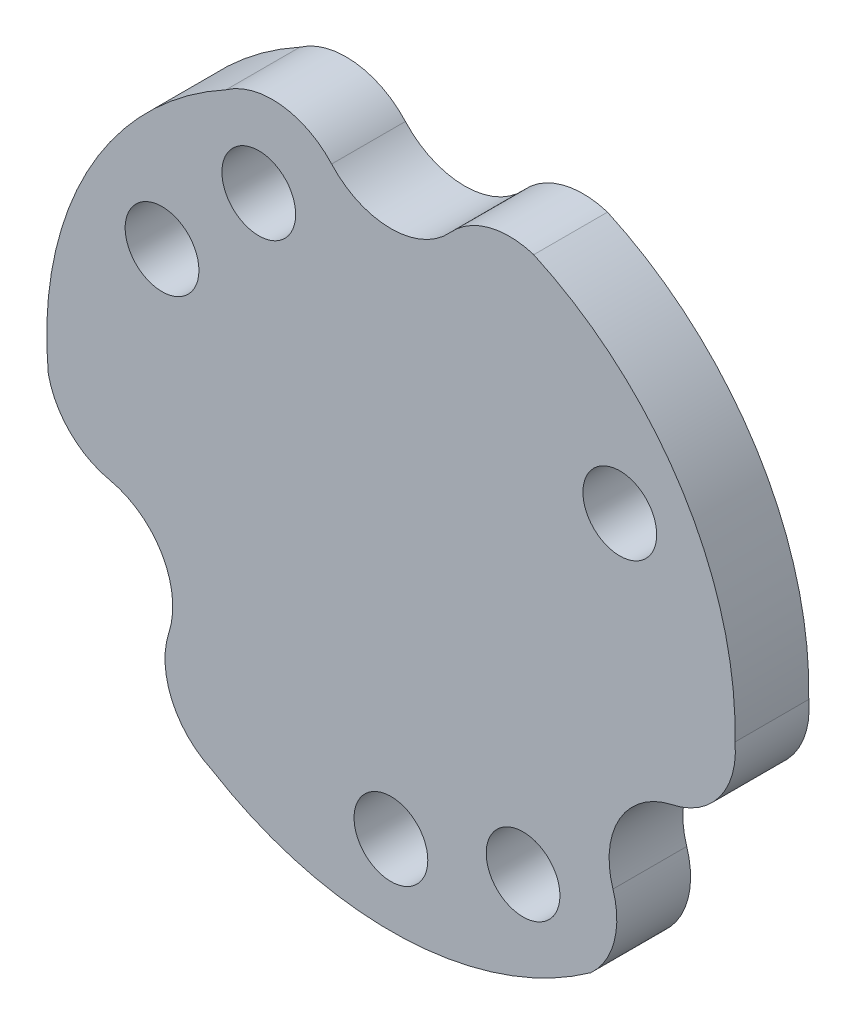
ISO-10303-21;
HEADER;
FILE_DESCRIPTION(('STEP AP214'),'2;1');
FILE_NAME('part.step','',(''),(''),'','','');
FILE_SCHEMA(('AUTOMOTIVE_DESIGN { 1 0 10303 214 1 1 1 1 }'));
ENDSEC;
DATA;
#1=APPLICATION_CONTEXT('core data for automotive mechanical design processes');
#2=APPLICATION_PROTOCOL_DEFINITION('international standard','automotive_design',2000,#1);
#3=PRODUCT_CONTEXT('',#1,'mechanical');
#4=PRODUCT('Part','Part','',(#3));
#5=PRODUCT_RELATED_PRODUCT_CATEGORY('part','',(#4));
#6=PRODUCT_DEFINITION_FORMATION('','',#4);
#7=PRODUCT_DEFINITION_CONTEXT('part definition',#1,'design');
#8=PRODUCT_DEFINITION('design','',#6,#7);
#9=PRODUCT_DEFINITION_SHAPE('','',#8);
#10=(LENGTH_UNIT() NAMED_UNIT(*) SI_UNIT(.MILLI.,.METRE.));
#11=(NAMED_UNIT(*) PLANE_ANGLE_UNIT() SI_UNIT($,.RADIAN.));
#12=(NAMED_UNIT(*) SI_UNIT($,.STERADIAN.) SOLID_ANGLE_UNIT());
#13=UNCERTAINTY_MEASURE_WITH_UNIT(LENGTH_MEASURE(1.E-05),#10,'distance_accuracy_value','');
#14=(GEOMETRIC_REPRESENTATION_CONTEXT(3) GLOBAL_UNCERTAINTY_ASSIGNED_CONTEXT((#13)) GLOBAL_UNIT_ASSIGNED_CONTEXT((#10,
#11,#12)) REPRESENTATION_CONTEXT('',''));
#15=CARTESIAN_POINT('',(0.,0.,0.));
#16=DIRECTION('',(0.,0.,1.));
#17=DIRECTION('',(1.,0.,0.));
#18=AXIS2_PLACEMENT_3D('',#15,#16,#17);
#19=CARTESIAN_POINT('',(5.38035373757222,-0.322325392410559,3.));
#20=DIRECTION('',(0.,0.,1.));
#21=DIRECTION('',(1.,0.,0.));
#22=AXIS2_PLACEMENT_3D('',#19,#20,#21);
#23=PLANE('',#22);
#24=CARTESIAN_POINT('',(5.37500000000057,-9.30977309068273,3.));
#25=DIRECTION('',(0.,0.,1.));
#26=DIRECTION('',(1.,0.,0.));
#27=AXIS2_PLACEMENT_3D('',#24,#25,#26);
#28=CIRCLE('',#27,1.49999999999978);
#29=CARTESIAN_POINT('',(6.87500000000036,-9.30977309068273,3.));
#30=VERTEX_POINT('',#29);
#31=EDGE_CURVE('E295',#30,#30,#28,.T.);
#32=ORIENTED_EDGE('',*,*,#31,.F.);
#33=EDGE_LOOP('',(#32));
#34=FACE_BOUND('',#33,.T.);
#35=CARTESIAN_POINT('',(0.,-10.75,3.));
#36=DIRECTION('',(0.,0.,1.));
#37=DIRECTION('',(1.,0.,0.));
#38=AXIS2_PLACEMENT_3D('',#35,#36,#37);
#39=CIRCLE('',#38,1.5);
#40=CARTESIAN_POINT('',(1.5,-10.75,3.));
#41=VERTEX_POINT('',#40);
#42=EDGE_CURVE('E307',#41,#41,#39,.T.);
#43=ORIENTED_EDGE('',*,*,#42,.F.);
#44=EDGE_LOOP('',(#43));
#45=FACE_BOUND('',#44,.T.);
#46=CARTESIAN_POINT('',(10.7607074751444,-0.644650784821117,3.));
#47=DIRECTION('',(0.,0.,1.));
#48=DIRECTION('',(1.,0.,0.));
#49=AXIS2_PLACEMENT_3D('',#46,#47,#48);
#50=CIRCLE('',#49,3.25);
#51=CARTESIAN_POINT('',(11.4425315640548,-3.82232539242045,3.));
#52=VERTEX_POINT('',#51);
#53=CARTESIAN_POINT('',(13.9959775932843,-0.335575935195618,3.));
#54=VERTEX_POINT('',#53);
#55=EDGE_CURVE('E177',#52,#54,#50,.T.);
#56=ORIENTED_EDGE('',*,*,#55,.T.);
#57=CARTESIAN_POINT('',(0.,0.,3.));
#58=DIRECTION('',(0.,0.,1.));
#59=DIRECTION('',(1.,0.,0.));
#60=AXIS2_PLACEMENT_3D('',#57,#58,#59);
#61=CIRCLE('',#60,14.);
#62=CARTESIAN_POINT('',(5.80943087987062,12.7377593340432,3.));
#63=VERTEX_POINT('',#62);
#64=EDGE_CURVE('E105',#54,#63,#61,.T.);
#65=ORIENTED_EDGE('',*,*,#64,.T.);
#66=CARTESIAN_POINT('',(4.82206978136234,9.64137142857136,3.));
#67=DIRECTION('',(0.,0.,1.));
#68=DIRECTION('',(1.,0.,0.));
#69=AXIS2_PLACEMENT_3D('',#66,#67,#68);
#70=CIRCLE('',#69,3.25);
#71=CARTESIAN_POINT('',(2.41103489067909,11.8206857142833,3.));
#72=VERTEX_POINT('',#71);
#73=EDGE_CURVE('E204',#63,#72,#70,.T.);
#74=ORIENTED_EDGE('',*,*,#73,.T.);
#75=CARTESIAN_POINT('',(1.07437023516552E-11,13.9999999999817,3.));
#76=DIRECTION('',(0.,0.,-1.));
#77=DIRECTION('',(1.,0.,0.));
#78=AXIS2_PLACEMENT_3D('',#75,#76,#77);
#79=CIRCLE('',#78,3.24999999997992);
#80=CARTESIAN_POINT('',(-2.41103489066096,11.820685714287,3.));
#81=VERTEX_POINT('',#80);
#82=EDGE_CURVE('E223',#72,#81,#79,.T.);
#83=ORIENTED_EDGE('',*,*,#82,.T.);
#84=CARTESIAN_POINT('',(-4.82206978134755,9.64137142857876,3.));
#85=DIRECTION('',(0.,0.,1.));
#86=DIRECTION('',(1.,0.,0.));
#87=AXIS2_PLACEMENT_3D('',#84,#85,#86);
#88=CIRCLE('',#87,3.25);
#89=CARTESIAN_POINT('',(-6.70737151186402,12.2886601141799,3.));
#90=VERTEX_POINT('',#89);
#91=EDGE_CURVE('E220',#81,#90,#88,.T.);
#92=ORIENTED_EDGE('',*,*,#91,.T.);
#93=CARTESIAN_POINT('',(0.,0.,3.));
#94=DIRECTION('',(0.,0.,1.));
#95=DIRECTION('',(1.,0.,0.));
#96=AXIS2_PLACEMENT_3D('',#93,#94,#95);
#97=CIRCLE('',#96,14.);
#98=CARTESIAN_POINT('',(-13.9359386105091,-1.33776494352389,3.));
#99=VERTEX_POINT('',#98);
#100=EDGE_CURVE('E222',#90,#99,#97,.T.);
#101=ORIENTED_EDGE('',*,*,#100,.T.);
#102=CARTESIAN_POINT('',(-10.7607074751454,-0.644650784804622,3.));
#103=DIRECTION('',(0.,0.,1.));
#104=DIRECTION('',(1.,0.,0.));
#105=AXIS2_PLACEMENT_3D('',#102,#103,#104);
#106=CIRCLE('',#105,3.25);
#107=CARTESIAN_POINT('',(-11.4425315640607,-3.82232539240291,3.));
#108=VERTEX_POINT('',#107);
#109=EDGE_CURVE('E225',#99,#108,#106,.T.);
#110=ORIENTED_EDGE('',*,*,#109,.T.);
#111=CARTESIAN_POINT('',(-12.1243556529717,-6.99999999998158,3.));
#112=DIRECTION('',(0.,0.,-1.));
#113=DIRECTION('',(1.,0.,0.));
#114=AXIS2_PLACEMENT_3D('',#111,#112,#113);
#115=CIRCLE('',#114,3.24999999997994);
#116=CARTESIAN_POINT('',(-9.03149667339383,-7.99836032186653,3.));
#117=VERTEX_POINT('',#116);
#118=EDGE_CURVE('E231',#108,#117,#115,.T.);
#119=ORIENTED_EDGE('',*,*,#118,.T.);
#120=CARTESIAN_POINT('',(-5.93863769379688,-8.99672064375764,3.));
#121=DIRECTION('',(0.,0.,1.));
#122=DIRECTION('',(1.,0.,0.));
#123=AXIS2_PLACEMENT_3D('',#120,#121,#122);
#124=CIRCLE('',#123,3.25);
#125=CARTESIAN_POINT('',(-7.28860608142029,-11.9530841789842,3.));
#126=VERTEX_POINT('',#125);
#127=EDGE_CURVE('E136',#117,#126,#124,.T.);
#128=ORIENTED_EDGE('',*,*,#127,.T.);
#129=CARTESIAN_POINT('',(0.,0.,3.));
#130=DIRECTION('',(0.,0.,1.));
#131=DIRECTION('',(1.,0.,0.));
#132=AXIS2_PLACEMENT_3D('',#129,#130,#131);
#133=CIRCLE('',#132,14.);
#134=CARTESIAN_POINT('',(8.12650773063849,-11.3999943905194,3.));
#135=VERTEX_POINT('',#134);
#136=EDGE_CURVE('E130',#126,#135,#133,.T.);
#137=ORIENTED_EDGE('',*,*,#136,.T.);
#138=CARTESIAN_POINT('',(5.93863769378309,-8.99672064376674,3.));
#139=DIRECTION('',(0.,0.,1.));
#140=DIRECTION('',(1.,0.,0.));
#141=AXIS2_PLACEMENT_3D('',#138,#139,#140);
#142=CIRCLE('',#141,3.25);
#143=CARTESIAN_POINT('',(9.03149667338157,-7.99836032188037,3.));
#144=VERTEX_POINT('',#143);
#145=EDGE_CURVE('E134',#135,#144,#142,.T.);
#146=ORIENTED_EDGE('',*,*,#145,.T.);
#147=CARTESIAN_POINT('',(12.124355652961,-7.00000000000017,3.));
#148=DIRECTION('',(0.,0.,-1.));
#149=DIRECTION('',(1.,0.,0.));
#150=AXIS2_PLACEMENT_3D('',#147,#148,#149);
#151=CIRCLE('',#150,3.24999999997994);
#152=EDGE_CURVE('E50',#144,#52,#151,.T.);
#153=ORIENTED_EDGE('',*,*,#152,.T.);
#154=EDGE_LOOP('',(#56,#65,#74,#83,#92,#101,#110,#119,#128,#137,#146,#153));
#155=FACE_BOUND('',#154,.T.);
#156=CARTESIAN_POINT('',(9.30977309068262,5.37500000000016,3.));
#157=DIRECTION('',(0.,0.,1.));
#158=DIRECTION('',(1.,0.,0.));
#159=AXIS2_PLACEMENT_3D('',#156,#157,#158);
#160=CIRCLE('',#159,1.5);
#161=CARTESIAN_POINT('',(10.8097730906826,5.37500000000016,3.));
#162=VERTEX_POINT('',#161);
#163=EDGE_CURVE('E158',#162,#162,#160,.T.);
#164=ORIENTED_EDGE('',*,*,#163,.F.);
#165=EDGE_LOOP('',(#164));
#166=FACE_BOUND('',#165,.T.);
#167=CARTESIAN_POINT('',(-9.30977309068277,5.37499999999991,3.));
#168=DIRECTION('',(0.,0.,1.));
#169=DIRECTION('',(1.,0.,0.));
#170=AXIS2_PLACEMENT_3D('',#167,#168,#169);
#171=CIRCLE('',#170,1.5);
#172=CARTESIAN_POINT('',(-7.80977309068277,5.37499999999991,3.));
#173=VERTEX_POINT('',#172);
#174=EDGE_CURVE('E301',#173,#173,#171,.T.);
#175=ORIENTED_EDGE('',*,*,#174,.F.);
#176=EDGE_LOOP('',(#175));
#177=FACE_BOUND('',#176,.T.);
#178=CARTESIAN_POINT('',(-5.37500000000028,9.30977309068221,3.));
#179=DIRECTION('',(0.,0.,1.));
#180=DIRECTION('',(1.,0.,0.));
#181=AXIS2_PLACEMENT_3D('',#178,#179,#180);
#182=CIRCLE('',#181,1.50000000000038);
#183=CARTESIAN_POINT('',(-3.8749999999999,9.30977309068221,3.));
#184=VERTEX_POINT('',#183);
#185=EDGE_CURVE('E286',#184,#184,#182,.T.);
#186=ORIENTED_EDGE('',*,*,#185,.F.);
#187=EDGE_LOOP('',(#186));
#188=FACE_BOUND('',#187,.T.);
#189=ADVANCED_FACE('F33',(#34,#45,#155,#166,#177,#188),#23,.T.);
#190=CARTESIAN_POINT('',(5.38035373757222,-0.322325392410559,0.));
#191=DIRECTION('',(0.,0.,1.));
#192=DIRECTION('',(1.,0.,0.));
#193=AXIS2_PLACEMENT_3D('',#190,#191,#192);
#194=PLANE('',#193);
#195=CARTESIAN_POINT('',(10.7607074751444,-0.644650784821117,0.));
#196=DIRECTION('',(0.,0.,1.));
#197=DIRECTION('',(1.,0.,0.));
#198=AXIS2_PLACEMENT_3D('',#195,#196,#197);
#199=CIRCLE('',#198,3.25);
#200=CARTESIAN_POINT('',(11.4425315640548,-3.82232539242045,0.));
#201=VERTEX_POINT('',#200);
#202=CARTESIAN_POINT('',(13.9959775932843,-0.335575935195618,0.));
#203=VERTEX_POINT('',#202);
#204=EDGE_CURVE('E154',#201,#203,#199,.T.);
#205=ORIENTED_EDGE('',*,*,#204,.F.);
#206=CARTESIAN_POINT('',(12.124355652961,-7.00000000000017,0.));
#207=DIRECTION('',(0.,0.,-1.));
#208=DIRECTION('',(1.,0.,0.));
#209=AXIS2_PLACEMENT_3D('',#206,#207,#208);
#210=CIRCLE('',#209,3.24999999997994);
#211=CARTESIAN_POINT('',(9.03149667338157,-7.99836032188037,0.));
#212=VERTEX_POINT('',#211);
#213=EDGE_CURVE('E97',#212,#201,#210,.T.);
#214=ORIENTED_EDGE('',*,*,#213,.F.);
#215=CARTESIAN_POINT('',(5.93863769378309,-8.99672064376674,0.));
#216=DIRECTION('',(0.,0.,1.));
#217=DIRECTION('',(1.,0.,0.));
#218=AXIS2_PLACEMENT_3D('',#215,#216,#217);
#219=CIRCLE('',#218,3.25);
#220=CARTESIAN_POINT('',(8.12650773063849,-11.3999943905194,0.));
#221=VERTEX_POINT('',#220);
#222=EDGE_CURVE('E91',#221,#212,#219,.T.);
#223=ORIENTED_EDGE('',*,*,#222,.F.);
#224=CARTESIAN_POINT('',(0.,0.,0.));
#225=DIRECTION('',(0.,0.,1.));
#226=DIRECTION('',(1.,0.,0.));
#227=AXIS2_PLACEMENT_3D('',#224,#225,#226);
#228=CIRCLE('',#227,14.);
#229=CARTESIAN_POINT('',(-7.28860608142029,-11.9530841789842,0.));
#230=VERTEX_POINT('',#229);
#231=EDGE_CURVE('E144',#230,#221,#228,.T.);
#232=ORIENTED_EDGE('',*,*,#231,.F.);
#233=CARTESIAN_POINT('',(-5.93863769379688,-8.99672064375764,0.));
#234=DIRECTION('',(0.,0.,1.));
#235=DIRECTION('',(1.,0.,0.));
#236=AXIS2_PLACEMENT_3D('',#233,#234,#235);
#237=CIRCLE('',#236,3.25);
#238=CARTESIAN_POINT('',(-9.03149667339383,-7.99836032186653,0.));
#239=VERTEX_POINT('',#238);
#240=EDGE_CURVE('E172',#239,#230,#237,.T.);
#241=ORIENTED_EDGE('',*,*,#240,.F.);
#242=CARTESIAN_POINT('',(-12.1243556529717,-6.99999999998158,0.));
#243=DIRECTION('',(0.,0.,-1.));
#244=DIRECTION('',(1.,0.,0.));
#245=AXIS2_PLACEMENT_3D('',#242,#243,#244);
#246=CIRCLE('',#245,3.24999999997994);
#247=CARTESIAN_POINT('',(-11.4425315640607,-3.82232539240291,0.));
#248=VERTEX_POINT('',#247);
#249=EDGE_CURVE('E170',#248,#239,#246,.T.);
#250=ORIENTED_EDGE('',*,*,#249,.F.);
#251=CARTESIAN_POINT('',(-10.7607074751454,-0.644650784804622,0.));
#252=DIRECTION('',(0.,0.,1.));
#253=DIRECTION('',(1.,0.,0.));
#254=AXIS2_PLACEMENT_3D('',#251,#252,#253);
#255=CIRCLE('',#254,3.25);
#256=CARTESIAN_POINT('',(-13.9359386105091,-1.33776494352389,0.));
#257=VERTEX_POINT('',#256);
#258=EDGE_CURVE('E168',#257,#248,#255,.T.);
#259=ORIENTED_EDGE('',*,*,#258,.F.);
#260=CARTESIAN_POINT('',(0.,0.,0.));
#261=DIRECTION('',(0.,0.,1.));
#262=DIRECTION('',(1.,0.,0.));
#263=AXIS2_PLACEMENT_3D('',#260,#261,#262);
#264=CIRCLE('',#263,14.);
#265=CARTESIAN_POINT('',(-6.70737151186402,12.2886601141799,0.));
#266=VERTEX_POINT('',#265);
#267=EDGE_CURVE('E166',#266,#257,#264,.T.);
#268=ORIENTED_EDGE('',*,*,#267,.F.);
#269=CARTESIAN_POINT('',(-4.82206978134755,9.64137142857876,0.));
#270=DIRECTION('',(0.,0.,1.));
#271=DIRECTION('',(1.,0.,0.));
#272=AXIS2_PLACEMENT_3D('',#269,#270,#271);
#273=CIRCLE('',#272,3.25);
#274=CARTESIAN_POINT('',(-2.41103489066096,11.820685714287,0.));
#275=VERTEX_POINT('',#274);
#276=EDGE_CURVE('E164',#275,#266,#273,.T.);
#277=ORIENTED_EDGE('',*,*,#276,.F.);
#278=CARTESIAN_POINT('',(1.07437023516552E-11,13.9999999999817,0.));
#279=DIRECTION('',(0.,0.,-1.));
#280=DIRECTION('',(1.,0.,0.));
#281=AXIS2_PLACEMENT_3D('',#278,#279,#280);
#282=CIRCLE('',#281,3.24999999997992);
#283=CARTESIAN_POINT('',(2.41103489067909,11.8206857142833,0.));
#284=VERTEX_POINT('',#283);
#285=EDGE_CURVE('E162',#284,#275,#282,.T.);
#286=ORIENTED_EDGE('',*,*,#285,.F.);
#287=CARTESIAN_POINT('',(4.82206978136234,9.64137142857136,0.));
#288=DIRECTION('',(0.,0.,1.));
#289=DIRECTION('',(1.,0.,0.));
#290=AXIS2_PLACEMENT_3D('',#287,#288,#289);
#291=CIRCLE('',#290,3.25);
#292=CARTESIAN_POINT('',(5.80943087987062,12.7377593340432,0.));
#293=VERTEX_POINT('',#292);
#294=EDGE_CURVE('E160',#293,#284,#291,.T.);
#295=ORIENTED_EDGE('',*,*,#294,.F.);
#296=CARTESIAN_POINT('',(0.,0.,0.));
#297=DIRECTION('',(0.,0.,1.));
#298=DIRECTION('',(1.,0.,0.));
#299=AXIS2_PLACEMENT_3D('',#296,#297,#298);
#300=CIRCLE('',#299,14.);
#301=EDGE_CURVE('E157',#203,#293,#300,.T.);
#302=ORIENTED_EDGE('',*,*,#301,.F.);
#303=EDGE_LOOP('',(#205,#214,#223,#232,#241,#250,#259,#268,#277,#286,#295,#302));
#304=FACE_BOUND('',#303,.T.);
#305=CARTESIAN_POINT('',(9.30977309068262,5.37500000000016,0.));
#306=DIRECTION('',(0.,0.,1.));
#307=DIRECTION('',(1.,0.,0.));
#308=AXIS2_PLACEMENT_3D('',#305,#306,#307);
#309=CIRCLE('',#308,1.5);
#310=CARTESIAN_POINT('',(10.8097730906826,5.37500000000016,0.));
#311=VERTEX_POINT('',#310);
#312=EDGE_CURVE('E310',#311,#311,#309,.T.);
#313=ORIENTED_EDGE('',*,*,#312,.T.);
#314=EDGE_LOOP('',(#313));
#315=FACE_BOUND('',#314,.T.);
#316=CARTESIAN_POINT('',(0.,-10.75,0.));
#317=DIRECTION('',(0.,0.,1.));
#318=DIRECTION('',(1.,0.,0.));
#319=AXIS2_PLACEMENT_3D('',#316,#317,#318);
#320=CIRCLE('',#319,1.5);
#321=CARTESIAN_POINT('',(1.5,-10.75,0.));
#322=VERTEX_POINT('',#321);
#323=EDGE_CURVE('E304',#322,#322,#320,.T.);
#324=ORIENTED_EDGE('',*,*,#323,.T.);
#325=EDGE_LOOP('',(#324));
#326=FACE_BOUND('',#325,.T.);
#327=CARTESIAN_POINT('',(-9.30977309068277,5.37499999999991,0.));
#328=DIRECTION('',(0.,0.,1.));
#329=DIRECTION('',(1.,0.,0.));
#330=AXIS2_PLACEMENT_3D('',#327,#328,#329);
#331=CIRCLE('',#330,1.5);
#332=CARTESIAN_POINT('',(-7.80977309068277,5.37499999999991,0.));
#333=VERTEX_POINT('',#332);
#334=EDGE_CURVE('E298',#333,#333,#331,.T.);
#335=ORIENTED_EDGE('',*,*,#334,.T.);
#336=EDGE_LOOP('',(#335));
#337=FACE_BOUND('',#336,.T.);
#338=CARTESIAN_POINT('',(5.37500000000057,-9.30977309068273,0.));
#339=DIRECTION('',(0.,0.,1.));
#340=DIRECTION('',(1.,0.,0.));
#341=AXIS2_PLACEMENT_3D('',#338,#339,#340);
#342=CIRCLE('',#341,1.49999999999978);
#343=CARTESIAN_POINT('',(6.87500000000036,-9.30977309068273,0.));
#344=VERTEX_POINT('',#343);
#345=EDGE_CURVE('E292',#344,#344,#342,.T.);
#346=ORIENTED_EDGE('',*,*,#345,.T.);
#347=EDGE_LOOP('',(#346));
#348=FACE_BOUND('',#347,.T.);
#349=CARTESIAN_POINT('',(-5.37500000000028,9.30977309068221,0.));
#350=DIRECTION('',(0.,0.,1.));
#351=DIRECTION('',(1.,0.,0.));
#352=AXIS2_PLACEMENT_3D('',#349,#350,#351);
#353=CIRCLE('',#352,1.50000000000038);
#354=CARTESIAN_POINT('',(-3.8749999999999,9.30977309068221,0.));
#355=VERTEX_POINT('',#354);
#356=EDGE_CURVE('E289',#355,#355,#353,.T.);
#357=ORIENTED_EDGE('',*,*,#356,.T.);
#358=EDGE_LOOP('',(#357));
#359=FACE_BOUND('',#358,.T.);
#360=ADVANCED_FACE('F208',(#304,#315,#326,#337,#348,#359),#194,.F.);
#361=CARTESIAN_POINT('',(10.7607074751444,-0.644650784821117,3.));
#362=DIRECTION('',(0.,0.,-1.));
#363=DIRECTION('',(-1.,0.,0.));
#364=AXIS2_PLACEMENT_3D('',#361,#362,#363);
#365=CYLINDRICAL_SURFACE('',#364,3.25);
#366=ORIENTED_EDGE('',*,*,#204,.T.);
#367=DIRECTION('',(0.,0.,-1.));
#368=VECTOR('',#367,1.);
#369=CARTESIAN_POINT('',(13.9959775932843,-0.335575935195618,3.));
#370=LINE('',#369,#368);
#371=EDGE_CURVE('E11',#54,#203,#370,.T.);
#372=ORIENTED_EDGE('',*,*,#371,.F.);
#373=ORIENTED_EDGE('',*,*,#55,.F.);
#374=DIRECTION('',(0.,0.,-1.));
#375=VECTOR('',#374,1.);
#376=CARTESIAN_POINT('',(11.4425315640548,-3.82232539242045,3.));
#377=LINE('',#376,#375);
#378=EDGE_CURVE('E150',#52,#201,#377,.T.);
#379=ORIENTED_EDGE('',*,*,#378,.T.);
#380=EDGE_LOOP('',(#366,#372,#373,#379));
#381=FACE_BOUND('',#380,.T.);
#382=ADVANCED_FACE('F35',(#381),#365,.T.);
#383=CARTESIAN_POINT('',(0.,0.,3.));
#384=DIRECTION('',(0.,0.,-1.));
#385=DIRECTION('',(-1.,0.,0.));
#386=AXIS2_PLACEMENT_3D('',#383,#384,#385);
#387=CYLINDRICAL_SURFACE('',#386,14.);
#388=ORIENTED_EDGE('',*,*,#301,.T.);
#389=DIRECTION('',(0.,0.,-1.));
#390=VECTOR('',#389,1.);
#391=CARTESIAN_POINT('',(5.80943087987062,12.7377593340432,3.));
#392=LINE('',#391,#390);
#393=EDGE_CURVE('E42',#63,#293,#392,.T.);
#394=ORIENTED_EDGE('',*,*,#393,.F.);
#395=ORIENTED_EDGE('',*,*,#64,.F.);
#396=ORIENTED_EDGE('',*,*,#371,.T.);
#397=EDGE_LOOP('',(#388,#394,#395,#396));
#398=FACE_BOUND('',#397,.T.);
#399=ADVANCED_FACE('F429',(#398),#387,.T.);
#400=CARTESIAN_POINT('',(4.82206978136234,9.64137142857136,3.));
#401=DIRECTION('',(0.,0.,-1.));
#402=DIRECTION('',(-1.,0.,0.));
#403=AXIS2_PLACEMENT_3D('',#400,#401,#402);
#404=CYLINDRICAL_SURFACE('',#403,3.25);
#405=ORIENTED_EDGE('',*,*,#294,.T.);
#406=DIRECTION('',(0.,0.,-1.));
#407=VECTOR('',#406,1.);
#408=CARTESIAN_POINT('',(2.41103489067909,11.8206857142833,3.));
#409=LINE('',#408,#407);
#410=EDGE_CURVE('E196',#72,#284,#409,.T.);
#411=ORIENTED_EDGE('',*,*,#410,.F.);
#412=ORIENTED_EDGE('',*,*,#73,.F.);
#413=ORIENTED_EDGE('',*,*,#393,.T.);
#414=EDGE_LOOP('',(#405,#411,#412,#413));
#415=FACE_BOUND('',#414,.T.);
#416=ADVANCED_FACE('F202',(#415),#404,.T.);
#417=CARTESIAN_POINT('',(1.07437023516552E-11,13.9999999999817,3.));
#418=DIRECTION('',(0.,0.,-1.));
#419=DIRECTION('',(-1.,0.,0.));
#420=AXIS2_PLACEMENT_3D('',#417,#418,#419);
#421=CYLINDRICAL_SURFACE('',#420,3.24999999997992);
#422=ORIENTED_EDGE('',*,*,#285,.T.);
#423=DIRECTION('',(0.,0.,-1.));
#424=VECTOR('',#423,1.);
#425=CARTESIAN_POINT('',(-2.41103489066096,11.820685714287,3.));
#426=LINE('',#425,#424);
#427=EDGE_CURVE('E193',#81,#275,#426,.T.);
#428=ORIENTED_EDGE('',*,*,#427,.F.);
#429=ORIENTED_EDGE('',*,*,#82,.F.);
#430=ORIENTED_EDGE('',*,*,#410,.T.);
#431=EDGE_LOOP('',(#422,#428,#429,#430));
#432=FACE_BOUND('',#431,.T.);
#433=ADVANCED_FACE('F214',(#432),#421,.F.);
#434=CARTESIAN_POINT('',(-4.82206978134755,9.64137142857876,3.));
#435=DIRECTION('',(0.,0.,-1.));
#436=DIRECTION('',(-1.,0.,0.));
#437=AXIS2_PLACEMENT_3D('',#434,#435,#436);
#438=CYLINDRICAL_SURFACE('',#437,3.25);
#439=ORIENTED_EDGE('',*,*,#276,.T.);
#440=DIRECTION('',(0.,0.,-1.));
#441=VECTOR('',#440,1.);
#442=CARTESIAN_POINT('',(-6.70737151186402,12.2886601141799,3.));
#443=LINE('',#442,#441);
#444=EDGE_CURVE('E190',#90,#266,#443,.T.);
#445=ORIENTED_EDGE('',*,*,#444,.F.);
#446=ORIENTED_EDGE('',*,*,#91,.F.);
#447=ORIENTED_EDGE('',*,*,#427,.T.);
#448=EDGE_LOOP('',(#439,#445,#446,#447));
#449=FACE_BOUND('',#448,.T.);
#450=ADVANCED_FACE('F218',(#449),#438,.T.);
#451=CARTESIAN_POINT('',(0.,0.,3.));
#452=DIRECTION('',(0.,0.,-1.));
#453=DIRECTION('',(-1.,0.,0.));
#454=AXIS2_PLACEMENT_3D('',#451,#452,#453);
#455=CYLINDRICAL_SURFACE('',#454,14.);
#456=ORIENTED_EDGE('',*,*,#267,.T.);
#457=DIRECTION('',(0.,0.,-1.));
#458=VECTOR('',#457,1.);
#459=CARTESIAN_POINT('',(-13.9359386105091,-1.33776494352389,3.));
#460=LINE('',#459,#458);
#461=EDGE_CURVE('E187',#99,#257,#460,.T.);
#462=ORIENTED_EDGE('',*,*,#461,.F.);
#463=ORIENTED_EDGE('',*,*,#100,.F.);
#464=ORIENTED_EDGE('',*,*,#444,.T.);
#465=EDGE_LOOP('',(#456,#462,#463,#464));
#466=FACE_BOUND('',#465,.T.);
#467=ADVANCED_FACE('F394',(#466),#455,.T.);
#468=CARTESIAN_POINT('',(-10.7607074751454,-0.644650784804622,3.));
#469=DIRECTION('',(0.,0.,-1.));
#470=DIRECTION('',(-1.,0.,0.));
#471=AXIS2_PLACEMENT_3D('',#468,#469,#470);
#472=CYLINDRICAL_SURFACE('',#471,3.25);
#473=ORIENTED_EDGE('',*,*,#258,.T.);
#474=DIRECTION('',(0.,0.,-1.));
#475=VECTOR('',#474,1.);
#476=CARTESIAN_POINT('',(-11.4425315640607,-3.82232539240291,3.));
#477=LINE('',#476,#475);
#478=EDGE_CURVE('E184',#108,#248,#477,.T.);
#479=ORIENTED_EDGE('',*,*,#478,.F.);
#480=ORIENTED_EDGE('',*,*,#109,.F.);
#481=ORIENTED_EDGE('',*,*,#461,.T.);
#482=EDGE_LOOP('',(#473,#479,#480,#481));
#483=FACE_BOUND('',#482,.T.);
#484=ADVANCED_FACE('F385',(#483),#472,.T.);
#485=CARTESIAN_POINT('',(-12.1243556529717,-6.99999999998158,3.));
#486=DIRECTION('',(0.,0.,-1.));
#487=DIRECTION('',(-1.,0.,0.));
#488=AXIS2_PLACEMENT_3D('',#485,#486,#487);
#489=CYLINDRICAL_SURFACE('',#488,3.24999999997994);
#490=ORIENTED_EDGE('',*,*,#249,.T.);
#491=DIRECTION('',(0.,0.,-1.));
#492=VECTOR('',#491,1.);
#493=CARTESIAN_POINT('',(-9.03149667339383,-7.99836032186653,3.));
#494=LINE('',#493,#492);
#495=EDGE_CURVE('E181',#117,#239,#494,.T.);
#496=ORIENTED_EDGE('',*,*,#495,.F.);
#497=ORIENTED_EDGE('',*,*,#118,.F.);
#498=ORIENTED_EDGE('',*,*,#478,.T.);
#499=EDGE_LOOP('',(#490,#496,#497,#498));
#500=FACE_BOUND('',#499,.T.);
#501=ADVANCED_FACE('F237',(#500),#489,.F.);
#502=CARTESIAN_POINT('',(-5.93863769379688,-8.99672064375764,3.));
#503=DIRECTION('',(0.,0.,-1.));
#504=DIRECTION('',(-1.,0.,0.));
#505=AXIS2_PLACEMENT_3D('',#502,#503,#504);
#506=CYLINDRICAL_SURFACE('',#505,3.25);
#507=ORIENTED_EDGE('',*,*,#240,.T.);
#508=DIRECTION('',(0.,0.,-1.));
#509=VECTOR('',#508,1.);
#510=CARTESIAN_POINT('',(-7.28860608142029,-11.9530841789842,3.));
#511=LINE('',#510,#509);
#512=EDGE_CURVE('E145',#126,#230,#511,.T.);
#513=ORIENTED_EDGE('',*,*,#512,.F.);
#514=ORIENTED_EDGE('',*,*,#127,.F.);
#515=ORIENTED_EDGE('',*,*,#495,.T.);
#516=EDGE_LOOP('',(#507,#513,#514,#515));
#517=FACE_BOUND('',#516,.T.);
#518=ADVANCED_FACE('F241',(#517),#506,.T.);
#519=CARTESIAN_POINT('',(0.,0.,3.));
#520=DIRECTION('',(0.,0.,-1.));
#521=DIRECTION('',(-1.,0.,0.));
#522=AXIS2_PLACEMENT_3D('',#519,#520,#521);
#523=CYLINDRICAL_SURFACE('',#522,14.);
#524=ORIENTED_EDGE('',*,*,#231,.T.);
#525=DIRECTION('',(0.,0.,-1.));
#526=VECTOR('',#525,1.);
#527=CARTESIAN_POINT('',(8.12650773063849,-11.3999943905194,3.));
#528=LINE('',#527,#526);
#529=EDGE_CURVE('E141',#135,#221,#528,.T.);
#530=ORIENTED_EDGE('',*,*,#529,.F.);
#531=ORIENTED_EDGE('',*,*,#136,.F.);
#532=ORIENTED_EDGE('',*,*,#512,.T.);
#533=EDGE_LOOP('',(#524,#530,#531,#532));
#534=FACE_BOUND('',#533,.T.);
#535=ADVANCED_FACE('F142',(#534),#523,.T.);
#536=CARTESIAN_POINT('',(5.93863769378309,-8.99672064376674,3.));
#537=DIRECTION('',(0.,0.,-1.));
#538=DIRECTION('',(-1.,0.,0.));
#539=AXIS2_PLACEMENT_3D('',#536,#537,#538);
#540=CYLINDRICAL_SURFACE('',#539,3.25);
#541=ORIENTED_EDGE('',*,*,#222,.T.);
#542=DIRECTION('',(0.,0.,-1.));
#543=VECTOR('',#542,1.);
#544=CARTESIAN_POINT('',(9.03149667338157,-7.99836032188037,3.));
#545=LINE('',#544,#543);
#546=EDGE_CURVE('E146',#144,#212,#545,.T.);
#547=ORIENTED_EDGE('',*,*,#546,.F.);
#548=ORIENTED_EDGE('',*,*,#145,.F.);
#549=ORIENTED_EDGE('',*,*,#529,.T.);
#550=EDGE_LOOP('',(#541,#547,#548,#549));
#551=FACE_BOUND('',#550,.T.);
#552=ADVANCED_FACE('F148',(#551),#540,.T.);
#553=CARTESIAN_POINT('',(12.124355652961,-7.00000000000017,3.));
#554=DIRECTION('',(0.,0.,-1.));
#555=DIRECTION('',(-1.,0.,0.));
#556=AXIS2_PLACEMENT_3D('',#553,#554,#555);
#557=CYLINDRICAL_SURFACE('',#556,3.24999999997994);
#558=ORIENTED_EDGE('',*,*,#213,.T.);
#559=ORIENTED_EDGE('',*,*,#378,.F.);
#560=ORIENTED_EDGE('',*,*,#152,.F.);
#561=ORIENTED_EDGE('',*,*,#546,.T.);
#562=EDGE_LOOP('',(#558,#559,#560,#561));
#563=FACE_BOUND('',#562,.T.);
#564=ADVANCED_FACE('F245',(#563),#557,.F.);
#565=CARTESIAN_POINT('',(9.30977309068262,5.37500000000016,3.));
#566=DIRECTION('',(0.,0.,-1.));
#567=DIRECTION('',(-1.,0.,0.));
#568=AXIS2_PLACEMENT_3D('',#565,#566,#567);
#569=CYLINDRICAL_SURFACE('',#568,1.5);
#570=ORIENTED_EDGE('',*,*,#163,.T.);
#571=EDGE_LOOP('',(#570));
#572=FACE_BOUND('',#571,.T.);
#573=ORIENTED_EDGE('',*,*,#312,.F.);
#574=EDGE_LOOP('',(#573));
#575=FACE_BOUND('',#574,.T.);
#576=ADVANCED_FACE('F247',(#572,#575),#569,.F.);
#577=CARTESIAN_POINT('',(0.,-10.75,3.));
#578=DIRECTION('',(0.,0.,-1.));
#579=DIRECTION('',(-1.,0.,0.));
#580=AXIS2_PLACEMENT_3D('',#577,#578,#579);
#581=CYLINDRICAL_SURFACE('',#580,1.5);
#582=ORIENTED_EDGE('',*,*,#42,.T.);
#583=EDGE_LOOP('',(#582));
#584=FACE_BOUND('',#583,.T.);
#585=ORIENTED_EDGE('',*,*,#323,.F.);
#586=EDGE_LOOP('',(#585));
#587=FACE_BOUND('',#586,.T.);
#588=ADVANCED_FACE('F253',(#584,#587),#581,.F.);
#589=CARTESIAN_POINT('',(-9.30977309068277,5.37499999999991,3.));
#590=DIRECTION('',(0.,0.,-1.));
#591=DIRECTION('',(-1.,0.,0.));
#592=AXIS2_PLACEMENT_3D('',#589,#590,#591);
#593=CYLINDRICAL_SURFACE('',#592,1.5);
#594=ORIENTED_EDGE('',*,*,#174,.T.);
#595=EDGE_LOOP('',(#594));
#596=FACE_BOUND('',#595,.T.);
#597=ORIENTED_EDGE('',*,*,#334,.F.);
#598=EDGE_LOOP('',(#597));
#599=FACE_BOUND('',#598,.T.);
#600=ADVANCED_FACE('F269',(#596,#599),#593,.F.);
#601=CARTESIAN_POINT('',(5.37500000000057,-9.30977309068273,3.));
#602=DIRECTION('',(0.,0.,-1.));
#603=DIRECTION('',(-1.,0.,0.));
#604=AXIS2_PLACEMENT_3D('',#601,#602,#603);
#605=CYLINDRICAL_SURFACE('',#604,1.49999999999978);
#606=ORIENTED_EDGE('',*,*,#31,.T.);
#607=EDGE_LOOP('',(#606));
#608=FACE_BOUND('',#607,.T.);
#609=ORIENTED_EDGE('',*,*,#345,.F.);
#610=EDGE_LOOP('',(#609));
#611=FACE_BOUND('',#610,.T.);
#612=ADVANCED_FACE('F273',(#608,#611),#605,.F.);
#613=CARTESIAN_POINT('',(-5.37500000000028,9.30977309068221,3.));
#614=DIRECTION('',(0.,0.,-1.));
#615=DIRECTION('',(-1.,0.,0.));
#616=AXIS2_PLACEMENT_3D('',#613,#614,#615);
#617=CYLINDRICAL_SURFACE('',#616,1.50000000000038);
#618=ORIENTED_EDGE('',*,*,#185,.T.);
#619=EDGE_LOOP('',(#618));
#620=FACE_BOUND('',#619,.T.);
#621=ORIENTED_EDGE('',*,*,#356,.F.);
#622=EDGE_LOOP('',(#621));
#623=FACE_BOUND('',#622,.T.);
#624=ADVANCED_FACE('F277',(#620,#623),#617,.F.);
#625=CLOSED_SHELL('',(#189,#360,#382,#399,#416,#433,#450,#467,#484,#501,#518,#535,#552,#564,
#576,#588,#600,#612,#624));
#626=MANIFOLD_SOLID_BREP('B2',#625);
#627=ADVANCED_BREP_SHAPE_REPRESENTATION('',(#18,#626),#14);
#628=SHAPE_DEFINITION_REPRESENTATION(#9,#627);
ENDSEC;
END-ISO-10303-21;
